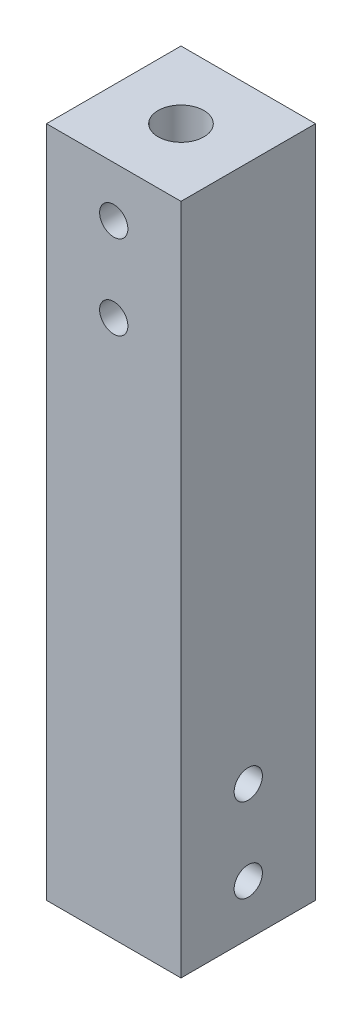
ISO-10303-21;
HEADER;
FILE_DESCRIPTION(('STEP AP214'),'2;1');
FILE_NAME('part.step','',(''),(''),'','','');
FILE_SCHEMA(('AUTOMOTIVE_DESIGN { 1 0 10303 214 1 1 1 1 }'));
ENDSEC;
DATA;
#1=APPLICATION_CONTEXT('core data for automotive mechanical design processes');
#2=APPLICATION_PROTOCOL_DEFINITION('international standard','automotive_design',2000,#1);
#3=PRODUCT_CONTEXT('',#1,'mechanical');
#4=PRODUCT('Part','Part','',(#3));
#5=PRODUCT_RELATED_PRODUCT_CATEGORY('part','',(#4));
#6=PRODUCT_DEFINITION_FORMATION('','',#4);
#7=PRODUCT_DEFINITION_CONTEXT('part definition',#1,'design');
#8=PRODUCT_DEFINITION('design','',#6,#7);
#9=PRODUCT_DEFINITION_SHAPE('','',#8);
#10=(LENGTH_UNIT() NAMED_UNIT(*) SI_UNIT(.MILLI.,.METRE.));
#11=(NAMED_UNIT(*) PLANE_ANGLE_UNIT() SI_UNIT($,.RADIAN.));
#12=(NAMED_UNIT(*) SI_UNIT($,.STERADIAN.) SOLID_ANGLE_UNIT());
#13=UNCERTAINTY_MEASURE_WITH_UNIT(LENGTH_MEASURE(1.E-05),#10,'distance_accuracy_value','');
#14=(GEOMETRIC_REPRESENTATION_CONTEXT(3) GLOBAL_UNCERTAINTY_ASSIGNED_CONTEXT((#13)) GLOBAL_UNIT_ASSIGNED_CONTEXT((#10,
#11,#12)) REPRESENTATION_CONTEXT('',''));
#15=CARTESIAN_POINT('',(0.,0.,0.));
#16=DIRECTION('',(0.,0.,1.));
#17=DIRECTION('',(1.,0.,0.));
#18=AXIS2_PLACEMENT_3D('',#15,#16,#17);
#19=CARTESIAN_POINT('',(0.,100.,0.));
#20=DIRECTION('',(1.,0.,0.));
#21=DIRECTION('',(0.,0.,-1.));
#22=AXIS2_PLACEMENT_3D('',#19,#20,#21);
#23=PLANE('',#22);
#24=DIRECTION('',(0.,0.,1.));
#25=VECTOR('',#24,1.);
#26=CARTESIAN_POINT('',(0.,0.,0.));
#27=LINE('',#26,#25);
#28=CARTESIAN_POINT('',(0.,0.,-20.));
#29=VERTEX_POINT('',#28);
#30=CARTESIAN_POINT('',(0.,0.,0.));
#31=VERTEX_POINT('',#30);
#32=EDGE_CURVE('E171',#29,#31,#27,.T.);
#33=ORIENTED_EDGE('',*,*,#32,.T.);
#34=DIRECTION('',(0.,-1.,0.));
#35=VECTOR('',#34,1.);
#36=CARTESIAN_POINT('',(0.,100.,0.));
#37=LINE('',#36,#35);
#38=CARTESIAN_POINT('',(0.,100.,0.));
#39=VERTEX_POINT('',#38);
#40=EDGE_CURVE('E11',#39,#31,#37,.T.);
#41=ORIENTED_EDGE('',*,*,#40,.F.);
#42=DIRECTION('',(0.,0.,1.));
#43=VECTOR('',#42,1.);
#44=CARTESIAN_POINT('',(0.,100.,0.));
#45=LINE('',#44,#43);
#46=CARTESIAN_POINT('',(0.,100.,-20.));
#47=VERTEX_POINT('',#46);
#48=EDGE_CURVE('E172',#47,#39,#45,.T.);
#49=ORIENTED_EDGE('',*,*,#48,.F.);
#50=DIRECTION('',(0.,-1.,0.));
#51=VECTOR('',#50,1.);
#52=CARTESIAN_POINT('',(0.,100.,-20.));
#53=LINE('',#52,#51);
#54=EDGE_CURVE('E182',#47,#29,#53,.T.);
#55=ORIENTED_EDGE('',*,*,#54,.T.);
#56=EDGE_LOOP('',(#33,#41,#49,#55));
#57=FACE_BOUND('',#56,.T.);
#58=ADVANCED_FACE('F45',(#57),#23,.F.);
#59=CARTESIAN_POINT('',(0.,100.,0.));
#60=DIRECTION('',(0.,0.,-1.));
#61=DIRECTION('',(-1.,0.,0.));
#62=AXIS2_PLACEMENT_3D('',#59,#60,#61);
#63=PLANE('',#62);
#64=CARTESIAN_POINT('',(10.,80.,0.));
#65=DIRECTION('',(0.,0.,1.));
#66=DIRECTION('',(1.,0.,0.));
#67=AXIS2_PLACEMENT_3D('',#64,#65,#66);
#68=CIRCLE('',#67,2.1);
#69=CARTESIAN_POINT('',(12.1,80.,0.));
#70=VERTEX_POINT('',#69);
#71=EDGE_CURVE('E141',#70,#70,#68,.T.);
#72=ORIENTED_EDGE('',*,*,#71,.F.);
#73=EDGE_LOOP('',(#72));
#74=FACE_BOUND('',#73,.T.);
#75=CARTESIAN_POINT('',(10.,92.5,0.));
#76=DIRECTION('',(0.,0.,1.));
#77=DIRECTION('',(1.,0.,0.));
#78=AXIS2_PLACEMENT_3D('',#75,#76,#77);
#79=CIRCLE('',#78,2.1);
#80=CARTESIAN_POINT('',(12.1,92.5,0.));
#81=VERTEX_POINT('',#80);
#82=EDGE_CURVE('E149',#81,#81,#79,.T.);
#83=ORIENTED_EDGE('',*,*,#82,.F.);
#84=EDGE_LOOP('',(#83));
#85=FACE_BOUND('',#84,.T.);
#86=DIRECTION('',(1.,0.,0.));
#87=VECTOR('',#86,1.);
#88=CARTESIAN_POINT('',(0.,0.,0.));
#89=LINE('',#88,#87);
#90=CARTESIAN_POINT('',(20.,0.,0.));
#91=VERTEX_POINT('',#90);
#92=EDGE_CURVE('E186',#31,#91,#89,.T.);
#93=ORIENTED_EDGE('',*,*,#92,.T.);
#94=DIRECTION('',(0.,-1.,0.));
#95=VECTOR('',#94,1.);
#96=CARTESIAN_POINT('',(20.,100.,0.));
#97=LINE('',#96,#95);
#98=CARTESIAN_POINT('',(20.,100.,0.));
#99=VERTEX_POINT('',#98);
#100=EDGE_CURVE('E60',#99,#91,#97,.T.);
#101=ORIENTED_EDGE('',*,*,#100,.F.);
#102=DIRECTION('',(1.,0.,0.));
#103=VECTOR('',#102,1.);
#104=CARTESIAN_POINT('',(0.,100.,0.));
#105=LINE('',#104,#103);
#106=EDGE_CURVE('E100',#39,#99,#105,.T.);
#107=ORIENTED_EDGE('',*,*,#106,.F.);
#108=ORIENTED_EDGE('',*,*,#40,.T.);
#109=EDGE_LOOP('',(#93,#101,#107,#108));
#110=FACE_BOUND('',#109,.T.);
#111=ADVANCED_FACE('F253',(#74,#85,#110),#63,.F.);
#112=CARTESIAN_POINT('',(20.,100.,0.));
#113=DIRECTION('',(-1.,0.,0.));
#114=DIRECTION('',(0.,0.,1.));
#115=AXIS2_PLACEMENT_3D('',#112,#113,#114);
#116=PLANE('',#115);
#117=CARTESIAN_POINT('',(20.,20.,-10.));
#118=DIRECTION('',(1.,0.,0.));
#119=DIRECTION('',(0.,0.,-1.));
#120=AXIS2_PLACEMENT_3D('',#117,#118,#119);
#121=CIRCLE('',#120,2.09999999999999);
#122=CARTESIAN_POINT('',(20.,20.,-12.1));
#123=VERTEX_POINT('',#122);
#124=EDGE_CURVE('E131',#123,#123,#121,.T.);
#125=ORIENTED_EDGE('',*,*,#124,.F.);
#126=EDGE_LOOP('',(#125));
#127=FACE_BOUND('',#126,.T.);
#128=CARTESIAN_POINT('',(20.,7.5,-10.));
#129=DIRECTION('',(1.,0.,0.));
#130=DIRECTION('',(0.,0.,-1.));
#131=AXIS2_PLACEMENT_3D('',#128,#129,#130);
#132=CIRCLE('',#131,2.09999999999999);
#133=CARTESIAN_POINT('',(20.,7.5,-12.1));
#134=VERTEX_POINT('',#133);
#135=EDGE_CURVE('E130',#134,#134,#132,.T.);
#136=ORIENTED_EDGE('',*,*,#135,.F.);
#137=EDGE_LOOP('',(#136));
#138=FACE_BOUND('',#137,.T.);
#139=DIRECTION('',(0.,0.,-1.));
#140=VECTOR('',#139,1.);
#141=CARTESIAN_POINT('',(20.,0.,0.));
#142=LINE('',#141,#140);
#143=CARTESIAN_POINT('',(20.,0.,-20.));
#144=VERTEX_POINT('',#143);
#145=EDGE_CURVE('E87',#91,#144,#142,.T.);
#146=ORIENTED_EDGE('',*,*,#145,.T.);
#147=DIRECTION('',(0.,-1.,0.));
#148=VECTOR('',#147,1.);
#149=CARTESIAN_POINT('',(20.,100.,-20.));
#150=LINE('',#149,#148);
#151=CARTESIAN_POINT('',(20.,100.,-20.));
#152=VERTEX_POINT('',#151);
#153=EDGE_CURVE('E195',#152,#144,#150,.T.);
#154=ORIENTED_EDGE('',*,*,#153,.F.);
#155=DIRECTION('',(0.,0.,-1.));
#156=VECTOR('',#155,1.);
#157=CARTESIAN_POINT('',(20.,100.,0.));
#158=LINE('',#157,#156);
#159=EDGE_CURVE('E177',#99,#152,#158,.T.);
#160=ORIENTED_EDGE('',*,*,#159,.F.);
#161=ORIENTED_EDGE('',*,*,#100,.T.);
#162=EDGE_LOOP('',(#146,#154,#160,#161));
#163=FACE_BOUND('',#162,.T.);
#164=ADVANCED_FACE('F258',(#127,#138,#163),#116,.F.);
#165=CARTESIAN_POINT('',(0.,100.,-20.));
#166=DIRECTION('',(0.,0.,1.));
#167=DIRECTION('',(1.,0.,0.));
#168=AXIS2_PLACEMENT_3D('',#165,#166,#167);
#169=PLANE('',#168);
#170=DIRECTION('',(-1.,0.,0.));
#171=VECTOR('',#170,1.);
#172=CARTESIAN_POINT('',(0.,0.,-20.));
#173=LINE('',#172,#171);
#174=EDGE_CURVE('E93',#144,#29,#173,.T.);
#175=ORIENTED_EDGE('',*,*,#174,.T.);
#176=ORIENTED_EDGE('',*,*,#54,.F.);
#177=DIRECTION('',(-1.,0.,0.));
#178=VECTOR('',#177,1.);
#179=CARTESIAN_POINT('',(0.,100.,-20.));
#180=LINE('',#179,#178);
#181=EDGE_CURVE('E69',#152,#47,#180,.T.);
#182=ORIENTED_EDGE('',*,*,#181,.F.);
#183=ORIENTED_EDGE('',*,*,#153,.T.);
#184=EDGE_LOOP('',(#175,#176,#182,#183));
#185=FACE_BOUND('',#184,.T.);
#186=ADVANCED_FACE('F268',(#185),#169,.F.);
#187=CARTESIAN_POINT('',(0.,100.,0.));
#188=DIRECTION('',(0.,-1.,0.));
#189=DIRECTION('',(0.,0.,-1.));
#190=AXIS2_PLACEMENT_3D('',#187,#188,#189);
#191=PLANE('',#190);
#192=CARTESIAN_POINT('',(10.,100.,-10.));
#193=DIRECTION('',(0.,1.,0.));
#194=DIRECTION('',(0.,0.,1.));
#195=AXIS2_PLACEMENT_3D('',#192,#193,#194);
#196=CIRCLE('',#195,3.39999999999999);
#197=CARTESIAN_POINT('',(10.,100.,-6.60000000000001));
#198=VERTEX_POINT('',#197);
#199=EDGE_CURVE('E163',#198,#198,#196,.T.);
#200=ORIENTED_EDGE('',*,*,#199,.F.);
#201=EDGE_LOOP('',(#200));
#202=FACE_BOUND('',#201,.T.);
#203=ORIENTED_EDGE('',*,*,#48,.T.);
#204=ORIENTED_EDGE('',*,*,#106,.T.);
#205=ORIENTED_EDGE('',*,*,#159,.T.);
#206=ORIENTED_EDGE('',*,*,#181,.T.);
#207=EDGE_LOOP('',(#203,#204,#205,#206));
#208=FACE_BOUND('',#207,.T.);
#209=ADVANCED_FACE('F266',(#202,#208),#191,.F.);
#210=CARTESIAN_POINT('',(0.,0.,0.));
#211=DIRECTION('',(0.,-1.,0.));
#212=DIRECTION('',(0.,0.,-1.));
#213=AXIS2_PLACEMENT_3D('',#210,#211,#212);
#214=PLANE('',#213);
#215=CARTESIAN_POINT('',(10.,0.,-10.));
#216=DIRECTION('',(0.,-1.,0.));
#217=DIRECTION('',(0.,0.,-1.));
#218=AXIS2_PLACEMENT_3D('',#215,#216,#217);
#219=CIRCLE('',#218,3.39999999999999);
#220=CARTESIAN_POINT('',(10.,0.,-13.4));
#221=VERTEX_POINT('',#220);
#222=EDGE_CURVE('E154',#221,#221,#219,.T.);
#223=ORIENTED_EDGE('',*,*,#222,.F.);
#224=EDGE_LOOP('',(#223));
#225=FACE_BOUND('',#224,.T.);
#226=ORIENTED_EDGE('',*,*,#32,.F.);
#227=ORIENTED_EDGE('',*,*,#174,.F.);
#228=ORIENTED_EDGE('',*,*,#145,.F.);
#229=ORIENTED_EDGE('',*,*,#92,.F.);
#230=EDGE_LOOP('',(#226,#227,#228,#229));
#231=FACE_BOUND('',#230,.T.);
#232=ADVANCED_FACE('F264',(#225,#231),#214,.T.);
#233=CARTESIAN_POINT('',(10.,86.25,-10.));
#234=DIRECTION('',(0.,1.,0.));
#235=DIRECTION('',(0.,0.,1.));
#236=AXIS2_PLACEMENT_3D('',#233,#234,#235);
#237=CONICAL_SURFACE('',#236,3.4,1.02974425867665);
#238=CARTESIAN_POINT('',(10.,84.2070738953063,-10.));
#239=VERTEX_POINT('',#238);
#240=VERTEX_LOOP('',#239);
#241=FACE_BOUND('',#240,.T.);
#242=CARTESIAN_POINT('',(10.,86.25,-10.));
#243=DIRECTION('',(0.,1.,0.));
#244=DIRECTION('',(0.,0.,1.));
#245=AXIS2_PLACEMENT_3D('',#242,#243,#244);
#246=CIRCLE('',#245,3.4);
#247=CARTESIAN_POINT('',(10.,86.25,-6.6));
#248=VERTEX_POINT('',#247);
#249=EDGE_CURVE('E167',#248,#248,#246,.T.);
#250=ORIENTED_EDGE('',*,*,#249,.T.);
#251=EDGE_LOOP('',(#250));
#252=FACE_BOUND('',#251,.T.);
#253=ADVANCED_FACE('F275',(#241,#252),#237,.F.);
#254=CARTESIAN_POINT('',(10.,100.,-10.));
#255=DIRECTION('',(0.,1.,0.));
#256=DIRECTION('',(0.,0.,1.));
#257=AXIS2_PLACEMENT_3D('',#254,#255,#256);
#258=CYLINDRICAL_SURFACE('',#257,3.39999999999999);
#259=CARTESIAN_POINT('',(10.,90.4,-6.6));
#260=CARTESIAN_POINT('',(10.106909584779,90.4000083055229,-6.60000759454753));
#261=CARTESIAN_POINT('',(10.2139637283466,90.4082205945675,-6.6050963994989));
#262=CARTESIAN_POINT('',(10.4248054443166,90.4406381015282,-6.62497197905334));
#263=CARTESIAN_POINT('',(10.5285857672476,90.4648765141404,-6.63977888215416));
#264=CARTESIAN_POINT('',(10.7294054383192,90.5279476239572,-6.67759750452509));
#265=CARTESIAN_POINT('',(10.8264754101919,90.5667080076093,-6.70056854105657));
#266=CARTESIAN_POINT('',(11.0124068170342,90.6572474812058,-6.75279017119617));
#267=CARTESIAN_POINT('',(11.1012694815828,90.7090246167031,-6.78203982198288));
#268=CARTESIAN_POINT('',(11.2761942855193,90.8286450562407,-6.84711126815642));
#269=CARTESIAN_POINT('',(11.3614824432051,90.8974335783531,-6.88326950093501));
#270=CARTESIAN_POINT('',(11.5200639802845,91.0469666030035,-6.95745373463822));
#271=CARTESIAN_POINT('',(11.5933411812988,91.1277269570348,-6.99548216652543));
#272=CARTESIAN_POINT('',(11.7356266357533,91.3113783931178,-7.07509364794456));
#273=CARTESIAN_POINT('',(11.8028037152635,91.4157832379848,-7.11648579846966));
#274=CARTESIAN_POINT('',(11.9184431569926,91.6368282791004,-7.19208892783604));
#275=CARTESIAN_POINT('',(11.966936812201,91.7534475967868,-7.22631187016598));
#276=CARTESIAN_POINT('',(12.0330489780256,91.9654756049783,-7.27457460141851));
#277=CARTESIAN_POINT('',(12.0553814632939,92.0587461256088,-7.29153312049159));
#278=CARTESIAN_POINT('',(12.0871147107371,92.2486316697551,-7.31590483461944));
#279=CARTESIAN_POINT('',(12.0965330713176,92.3452419575364,-7.32333101874547));
#280=CARTESIAN_POINT('',(12.1018799243419,92.5393094913836,-7.32752621478394));
#281=CARTESIAN_POINT('',(12.0977758626191,92.6367682171836,-7.32426950856293));
#282=CARTESIAN_POINT('',(12.0762800260879,92.829340632346,-7.30755972114127));
#283=CARTESIAN_POINT('',(12.0588777796012,92.9244524126432,-7.29409860452696));
#284=CARTESIAN_POINT('',(12.0122310678369,93.1080570413213,-7.25924428337621));
#285=CARTESIAN_POINT('',(11.9832268862627,93.1966434253279,-7.23801272610408));
#286=CARTESIAN_POINT('',(11.9144943411793,93.367891406903,-7.18993475740746));
#287=CARTESIAN_POINT('',(11.874762148418,93.4505508755624,-7.16308634187592));
#288=CARTESIAN_POINT('',(11.7773200977145,93.6237139063362,-7.10085345842752));
#289=CARTESIAN_POINT('',(11.7176495762249,93.7128759473009,-7.06480653009435));
#290=CARTESIAN_POINT('',(11.5857435319882,93.8808846428696,-6.99149142415717));
#291=CARTESIAN_POINT('',(11.5134953298841,93.9597207461657,-6.95422204528828));
#292=CARTESIAN_POINT('',(11.3450518867951,94.1174512772022,-6.87577897707396));
#293=CARTESIAN_POINT('',(11.2468776589489,94.194408717777,-6.83491188390569));
#294=CARTESIAN_POINT('',(11.0365789119405,94.330619808723,-6.7599475152374));
#295=CARTESIAN_POINT('',(10.9244605763262,94.3898812670486,-6.72584725625851));
#296=CARTESIAN_POINT('',(10.6956810599504,94.4850633276262,-6.66997298784579));
#297=CARTESIAN_POINT('',(10.5796453934955,94.5221240167928,-6.64760605530692));
#298=CARTESIAN_POINT('',(10.3413214514468,94.5756583354393,-6.61504875173137));
#299=CARTESIAN_POINT('',(10.2190418461389,94.5921597454076,-6.60484195027673));
#300=CARTESIAN_POINT('',(9.99098055767571,94.6026225885336,-6.59837982713387));
#301=CARTESIAN_POINT('',(9.88537226897439,94.5995003702956,-6.60031923792768));
#302=CARTESIAN_POINT('',(9.67643465040614,94.5775783726873,-6.61381406535331));
#303=CARTESIAN_POINT('',(9.57310520186386,94.5587794117044,-6.62536898001818));
#304=CARTESIAN_POINT('',(9.37514682429585,94.5074028314068,-6.65645886027858));
#305=CARTESIAN_POINT('',(9.28034069999321,94.4753230975318,-6.67570467572282));
#306=CARTESIAN_POINT('',(9.09753119340591,94.398783303796,-6.72060692992849));
#307=CARTESIAN_POINT('',(9.00952900698899,94.3543210738652,-6.74626449228702));
#308=CARTESIAN_POINT('',(8.83308855573481,94.2492606487338,-6.80503157314829));
#309=CARTESIAN_POINT('',(8.7455219793061,94.1874789307399,-6.83863432502225));
#310=CARTESIAN_POINT('',(8.58136732717812,94.0520394372682,-6.90880785768252));
#311=CARTESIAN_POINT('',(8.50479187869471,93.9783682055564,-6.94538197781452));
#312=CARTESIAN_POINT('',(8.35361947386747,93.8092196505114,-7.02381844852093));
#313=CARTESIAN_POINT('',(8.28082405252452,93.7121323185385,-7.06569927302227));
#314=CARTESIAN_POINT('',(8.15237135431424,93.5055026910924,-7.14483572716953));
#315=CARTESIAN_POINT('',(8.09670021678827,93.3959705674928,-7.18209508284696));
#316=CARTESIAN_POINT('',(8.01444407675158,93.1906911770339,-7.23964919733963));
#317=CARTESIAN_POINT('',(7.9841923414248,93.0969596554427,-7.26186640457536));
#318=CARTESIAN_POINT('',(7.93697790125541,92.9046130547823,-7.29725611424552));
#319=CARTESIAN_POINT('',(7.91999502577463,92.8060056314165,-7.31044234133015));
#320=CARTESIAN_POINT('',(7.90025925943216,92.6059724164973,-7.3258158759708));
#321=CARTESIAN_POINT('',(7.89757893623707,92.5045348723925,-7.32794709157043));
#322=CARTESIAN_POINT('',(7.90684573577771,92.3027278137854,-7.32068414315933));
#323=CARTESIAN_POINT('',(7.91879888170083,92.2023587562326,-7.31128523330511));
#324=CARTESIAN_POINT('',(7.95518276990627,92.0127722733961,-7.28353404884088));
#325=CARTESIAN_POINT('',(7.97867463354935,91.9232674745665,-7.26585955475902));
#326=CARTESIAN_POINT('',(8.03655154179376,91.7494881718993,-7.22400636533244));
#327=CARTESIAN_POINT('',(8.07094092886698,91.665215769117,-7.19982507772511));
#328=CARTESIAN_POINT('',(8.15546079444471,91.4908385119908,-7.14332043608681));
#329=CARTESIAN_POINT('',(8.207168962054,91.4017207415736,-7.11032149883882));
#330=CARTESIAN_POINT('',(8.32248061149125,91.2325514757411,-7.04188678679635));
#331=CARTESIAN_POINT('',(8.3860938746898,91.1525075229444,-7.0064490234797));
#332=CARTESIAN_POINT('',(8.53738396569212,90.9882311087828,-6.92929353068203));
#333=CARTESIAN_POINT('',(8.62733638960317,90.9060390792976,-6.88764735306934));
#334=CARTESIAN_POINT('',(8.82147085875531,90.7575833108155,-6.80906655444783));
#335=CARTESIAN_POINT('',(8.92566047221144,90.691328095578,-6.77213445968674));
#336=CARTESIAN_POINT('',(9.14545906166423,90.5777976841855,-6.70717367338645));
#337=CARTESIAN_POINT('',(9.26096135551529,90.530363121331,-6.67907066267852));
#338=CARTESIAN_POINT('',(9.4403821716705,90.4749672626327,-6.64581572086231));
#339=CARTESIAN_POINT('',(9.50115474403114,90.4591357602464,-6.63621903883405));
#340=CARTESIAN_POINT('',(9.62426510173862,90.4329317219189,-6.62025743287795));
#341=CARTESIAN_POINT('',(9.6866016490095,90.4225550023467,-6.61389003233458));
#342=CARTESIAN_POINT('',(9.79088936651449,90.4100186901288,-6.60618099421612));
#343=CARTESIAN_POINT('',(9.83258597172236,90.4062659172943,-6.60386732476643));
#344=CARTESIAN_POINT('',(9.91618096797895,90.4012548698967,-6.60077529316417));
#345=CARTESIAN_POINT('',(9.95807937084903,90.3999967432972,-6.59999702207982));
#346=CARTESIAN_POINT('',(10.,90.4,-6.6));
#347=B_SPLINE_CURVE_WITH_KNOTS('',3,(#259,#260,#261,#262,#263,#264,#265,#266,#267,#268,#269,
#270,#271,#272,#273,#274,#275,#276,#277,#278,#279,#280,#281,#282,#283,#284,#285,#286,#287,#288,
#289,#290,#291,#292,#293,#294,#295,#296,#297,#298,#299,#300,#301,#302,#303,#304,#305,#306,#307,
#308,#309,#310,#311,#312,#313,#314,#315,#316,#317,#318,#319,#320,#321,#322,#323,#324,#325,#326,
#327,#328,#329,#330,#331,#332,#333,#334,#335,#336,#337,#338,#339,#340,#341,#342,#343,#344,#345,
#346),.UNSPECIFIED.,.T.,.F.,(4,2,2,2,2,2,2,2,2,2,2,2,2,2,2,2,2,2,2,2,2,2,2,2,2,2,2,2,2,2,2,2,2,
2,2,2,2,2,2,2,2,2,2,4),(0.,0.32055939799291,0.641784855166923,0.961431551788741,
1.28103028254197,1.62584215223706,1.97111472233273,2.36182992370451,2.75188783882831,
3.04285199801862,3.33341925757458,3.62468654554332,3.91618342908424,4.20193227813956,
4.4877832574151,4.82605714883402,5.16467404450676,5.55649371866588,5.94814025488057,
6.31741099530852,6.68618221984855,7.00158556440314,7.31697244470072,7.62147541781026,
7.92603178960799,8.26166323151338,8.59767723091419,8.98107164334386,9.36415490884996,
9.66584505458902,9.96707568932728,10.2698332517716,10.5727154722024,10.8542488166005,
11.1358944884696,11.4592882598545,11.7829489113393,12.1674427472298,12.5521417735468,
12.9335099840297,13.1238232547395,13.3139903479583,13.4396783739624,13.5653738546052),.UNSPECIFIED.);
#348=CARTESIAN_POINT('',(10.,90.4,-6.6));
#349=VERTEX_POINT('',#348);
#350=EDGE_CURVE('E159',#349,#349,#347,.T.);
#351=ORIENTED_EDGE('',*,*,#350,.T.);
#352=EDGE_LOOP('',(#351));
#353=FACE_BOUND('',#352,.T.);
#354=CARTESIAN_POINT('',(9.63129406855639,92.7900036700708,-13.3799491025929));
#355=CARTESIAN_POINT('',(9.65111356220242,92.8093804211386,-13.3821108680189));
#356=CARTESIAN_POINT('',(9.67267078952993,92.8270190827772,-13.3842845231953));
#357=CARTESIAN_POINT('',(9.71844397164157,92.8585220608813,-13.3884002305228));
#358=CARTESIAN_POINT('',(9.74266620773809,92.8723771802601,-13.3903417119818));
#359=CARTESIAN_POINT('',(9.7932193591738,92.8961922123673,-13.3938014041982));
#360=CARTESIAN_POINT('',(9.81956554728729,92.9061201877377,-13.3953161167871));
#361=CARTESIAN_POINT('',(9.87348132810256,92.9217856719524,-13.3977523930356));
#362=CARTESIAN_POINT('',(9.90105036784806,92.9275250547356,-13.398674221924));
#363=CARTESIAN_POINT('',(9.95882739123461,92.9350133282234,-13.3998822311503));
#364=CARTESIAN_POINT('',(9.98907940766686,92.936434553324,-13.4001161755556));
#365=CARTESIAN_POINT('',(10.0494157466226,92.9343373429141,-13.3997748620723));
#366=CARTESIAN_POINT('',(10.0795000052387,92.9308171389356,-13.3991993144775));
#367=CARTESIAN_POINT('',(10.1391661153035,92.918788524235,-13.3972839947183));
#368=CARTESIAN_POINT('',(10.1687308300249,92.9101966463008,-13.3959314452442));
#369=CARTESIAN_POINT('',(10.2259359207021,92.888089569949,-13.392605816638));
#370=CARTESIAN_POINT('',(10.2535760386857,92.8745737130306,-13.3906326545139));
#371=CARTESIAN_POINT('',(10.3053247732215,92.8432298845371,-13.3863600622848));
#372=CARTESIAN_POINT('',(10.3295047610521,92.8255189980462,-13.3840700932468));
#373=CARTESIAN_POINT('',(10.3741640983998,92.7859072170798,-13.3794238363886));
#374=CARTESIAN_POINT('',(10.3946452446296,92.7640083676092,-13.3770675814132));
#375=CARTESIAN_POINT('',(10.4291532775219,92.7186904760515,-13.3728478623278));
#376=CARTESIAN_POINT('',(10.4435998158712,92.6955950212572,-13.3709590223395));
#377=CARTESIAN_POINT('',(10.4676525391931,92.6469782307085,-13.3677069544126));
#378=CARTESIAN_POINT('',(10.4772662625308,92.6214607472917,-13.3663429086696));
#379=CARTESIAN_POINT('',(10.489931543553,92.5727849583848,-13.3645210350162));
#380=CARTESIAN_POINT('',(10.493735691305,92.5498253850721,-13.3639600510503));
#381=CARTESIAN_POINT('',(10.4970358771788,92.5035955016247,-13.3634742080895));
#382=CARTESIAN_POINT('',(10.4965345008075,92.4803253863556,-13.3635489673246));
#383=CARTESIAN_POINT('',(10.4915139462796,92.436459984065,-13.3642857906915));
#384=CARTESIAN_POINT('',(10.4873761439805,92.4158185778245,-13.3648920940071));
#385=CARTESIAN_POINT('',(10.4758258715522,92.3754967211641,-13.3665447420789));
#386=CARTESIAN_POINT('',(10.4684130976294,92.3558163600811,-13.3675911276576));
#387=CARTESIAN_POINT('',(10.4503803211682,92.3172622033427,-13.3700507964373));
#388=CARTESIAN_POINT('',(10.4396672215642,92.2984329137987,-13.3714745354372));
#389=CARTESIAN_POINT('',(10.4155600589433,92.2626016739677,-13.374530674952));
#390=CARTESIAN_POINT('',(10.4021649730154,92.2456004247104,-13.3761631549947));
#391=CARTESIAN_POINT('',(10.3714066654575,92.2117704436714,-13.3796928044248));
#392=CARTESIAN_POINT('',(10.3537616589982,92.1951990955635,-13.3815984678181));
#393=CARTESIAN_POINT('',(10.3162120820769,92.1648437844021,-13.3853162786986));
#394=CARTESIAN_POINT('',(10.2963063651395,92.1510612455828,-13.387128378053));
#395=CARTESIAN_POINT('',(10.252021017678,92.1248230755495,-13.3907285236147));
#396=CARTESIAN_POINT('',(10.2273965187768,92.1127751756633,-13.3924825855408));
#397=CARTESIAN_POINT('',(10.1765686976831,92.0925821507525,-13.3955076991084));
#398=CARTESIAN_POINT('',(10.1503647527381,92.0844385766286,-13.3967785587677));
#399=CARTESIAN_POINT('',(10.0947143069554,92.0716308516652,-13.3988039234041));
#400=CARTESIAN_POINT('',(10.0651826524986,92.067325781603,-13.3995046797525));
#401=CARTESIAN_POINT('',(10.0058013177314,92.0635103468532,-13.4001248157618));
#402=CARTESIAN_POINT('',(9.97595157087841,92.0640010058775,-13.4000440285921));
#403=CARTESIAN_POINT('',(9.91581557307605,92.0698601739,-13.3990946258146));
#404=CARTESIAN_POINT('',(9.88554408424369,92.0753780735368,-13.3982018833675));
#405=CARTESIAN_POINT('',(9.82637765367679,92.0914162514136,-13.3956932376286));
#406=CARTESIAN_POINT('',(9.79748293623198,92.1019373416784,-13.3940772169503));
#407=CARTESIAN_POINT('',(9.74228131016279,92.1276765448892,-13.3903301362397));
#408=CARTESIAN_POINT('',(9.71594946454903,92.1428417999331,-13.3882049279737));
#409=CARTESIAN_POINT('',(9.66645637889417,92.1776776250621,-13.3836912214036));
#410=CARTESIAN_POINT('',(9.64329472456051,92.1973476055528,-13.3813027575766));
#411=CARTESIAN_POINT('',(9.60264962830954,92.2393297200457,-13.3767592426042));
#412=CARTESIAN_POINT('',(9.58488586411018,92.2613684741649,-13.3745994116458));
#413=CARTESIAN_POINT('',(9.55400641440723,92.3085232619652,-13.3706576990103));
#414=CARTESIAN_POINT('',(9.54088417535033,92.3336348889139,-13.3688752858818));
#415=CARTESIAN_POINT('',(9.52163715418822,92.3824958718309,-13.3661923137658));
#416=CARTESIAN_POINT('',(9.51479922166176,92.4059592546325,-13.3652043035011));
#417=CARTESIAN_POINT('',(9.50573879167162,92.453772748394,-13.3638858454626));
#418=CARTESIAN_POINT('',(9.50351147568835,92.4781219065192,-13.3635547112079));
#419=CARTESIAN_POINT('',(9.50380665078235,92.5237897235333,-13.3635979534837));
#420=CARTESIAN_POINT('',(9.50578044876456,92.5451140436425,-13.3638908346114));
#421=CARTESIAN_POINT('',(9.5132785396697,92.5871180350326,-13.3649838657497));
#422=CARTESIAN_POINT('',(9.51880365416721,92.6077975559822,-13.3657841331403));
#423=CARTESIAN_POINT('',(9.5330613623988,92.6478273822137,-13.3677914447594));
#424=CARTESIAN_POINT('',(9.54177215783468,92.6671856842192,-13.3689957200044));
#425=CARTESIAN_POINT('',(9.56201521914871,92.7043200954561,-13.3716869558394));
#426=CARTESIAN_POINT('',(9.57354520103201,92.722097469673,-13.3731736873781));
#427=CARTESIAN_POINT('',(9.59312155409625,92.7480087782947,-13.3755736614268));
#428=CARTESIAN_POINT('',(9.60031796746938,92.7568050397153,-13.3764347026831));
#429=CARTESIAN_POINT('',(9.615343769854,92.773832626371,-13.3781795342506));
#430=CARTESIAN_POINT('',(9.6231730411148,92.7820640561754,-13.379063320309));
#431=CARTESIAN_POINT('',(9.63129406855639,92.7900036700708,-13.3799491025929));
#432=B_SPLINE_CURVE_WITH_KNOTS('',3,(#354,#355,#356,#357,#358,#359,#360,#361,#362,#363,#364,
#365,#366,#367,#368,#369,#370,#371,#372,#373,#374,#375,#376,#377,#378,#379,#380,#381,#382,#383,
#384,#385,#386,#387,#388,#389,#390,#391,#392,#393,#394,#395,#396,#397,#398,#399,#400,#401,#402,
#403,#404,#405,#406,#407,#408,#409,#410,#411,#412,#413,#414,#415,#416,#417,#418,#419,#420,#421,
#422,#423,#424,#425,#426,#427,#428,#429,#430,#431),.UNSPECIFIED.,.T.,.F.,(4,2,2,2,2,2,2,2,2,2,2,
2,2,2,2,2,2,2,2,2,2,2,2,2,2,2,2,2,2,2,2,2,2,2,2,2,2,2,4),(0.,0.0833631966671376,
0.166927265543384,0.251157593237053,0.335350213894598,0.425789442183172,0.516261045655664,
0.608264813697467,0.700280890240562,0.789981171464563,0.879637762883259,0.961072187196749,
1.04237919049893,1.11182749231661,1.18123409270765,1.24412875514772,1.30702925306257,
1.37189791817481,1.43679137151757,1.50934692193135,1.58193943318535,1.66400305275109,
1.74609924318743,1.83524932101313,1.92441842951644,2.01632692581216,2.10825034407703,
2.19916414166343,2.29006604692457,2.37473953833018,2.45929299411095,2.53224297084463,
2.60511666955317,2.66905873976168,2.7330156078899,2.79654279242129,2.86001867925423,
2.8941830488092,2.92834107624642),.UNSPECIFIED.);
#433=CARTESIAN_POINT('',(9.63129406855639,92.7900036700708,-13.3799491025929));
#434=VERTEX_POINT('',#433);
#435=EDGE_CURVE('E153',#434,#434,#432,.T.);
#436=ORIENTED_EDGE('',*,*,#435,.T.);
#437=EDGE_LOOP('',(#436));
#438=FACE_BOUND('',#437,.T.);
#439=ORIENTED_EDGE('',*,*,#249,.F.);
#440=EDGE_LOOP('',(#439));
#441=FACE_BOUND('',#440,.T.);
#442=ORIENTED_EDGE('',*,*,#199,.T.);
#443=EDGE_LOOP('',(#442));
#444=FACE_BOUND('',#443,.T.);
#445=ADVANCED_FACE('F212',(#353,#438,#441,#444),#258,.F.);
#446=CARTESIAN_POINT('',(10.,13.75,-10.));
#447=DIRECTION('',(0.,-1.,0.));
#448=DIRECTION('',(0.,0.,-1.));
#449=AXIS2_PLACEMENT_3D('',#446,#447,#448);
#450=CONICAL_SURFACE('',#449,3.4,1.02974425867665);
#451=CARTESIAN_POINT('',(10.,15.7929261046937,-10.));
#452=VERTEX_POINT('',#451);
#453=VERTEX_LOOP('',#452);
#454=FACE_BOUND('',#453,.T.);
#455=CARTESIAN_POINT('',(10.,13.75,-10.));
#456=DIRECTION('',(0.,-1.,0.));
#457=DIRECTION('',(0.,0.,-1.));
#458=AXIS2_PLACEMENT_3D('',#455,#456,#457);
#459=CIRCLE('',#458,3.4);
#460=CARTESIAN_POINT('',(10.,13.75,-13.4));
#461=VERTEX_POINT('',#460);
#462=EDGE_CURVE('E158',#461,#461,#459,.T.);
#463=ORIENTED_EDGE('',*,*,#462,.T.);
#464=EDGE_LOOP('',(#463));
#465=FACE_BOUND('',#464,.T.);
#466=ADVANCED_FACE('F226',(#454,#465),#450,.F.);
#467=CARTESIAN_POINT('',(10.,0.,-10.));
#468=DIRECTION('',(0.,-1.,0.));
#469=DIRECTION('',(0.,0.,-1.));
#470=AXIS2_PLACEMENT_3D('',#467,#468,#469);
#471=CYLINDRICAL_SURFACE('',#470,3.39999999999999);
#472=CARTESIAN_POINT('',(12.6739483914242,7.5,-12.1));
#473=CARTESIAN_POINT('',(12.6739610113809,7.60467904226486,-12.0999918862109));
#474=CARTESIAN_POINT('',(12.6802093934933,7.70953493385813,-12.0921018484001));
#475=CARTESIAN_POINT('',(12.7041179400223,7.9157500842561,-12.0610919822798));
#476=CARTESIAN_POINT('',(12.7218106974976,8.01709848268177,-12.03792865267));
#477=CARTESIAN_POINT('',(12.7656635883293,8.212687802904,-11.9779929515485));
#478=CARTESIAN_POINT('',(12.7917515972957,8.3069811221234,-11.9413361311584));
#479=CARTESIAN_POINT('',(12.8493313139399,8.48796077410852,-11.8557922033485));
#480=CARTESIAN_POINT('',(12.8808229339303,8.57464723028045,-11.8069052943872));
#481=CARTESIAN_POINT('',(12.9506272563945,8.75041422270417,-11.6908448141345));
#482=CARTESIAN_POINT('',(12.9892936162628,8.83832824263121,-11.6221166664703));
#483=CARTESIAN_POINT('',(13.066244140119,9.00236489512897,-11.4714997465579));
#484=CARTESIAN_POINT('',(13.1045279499978,9.07847740669455,-11.3895997994133));
#485=CARTESIAN_POINT('',(13.1816928729535,9.22555351360142,-11.2033807878212));
#486=CARTESIAN_POINT('',(13.2201215347832,9.29487753703828,-11.0975604931066));
#487=CARTESIAN_POINT('',(13.2881161066096,9.41418665710414,-10.8729325645918));
#488=CARTESIAN_POINT('',(13.3176906093381,9.4641905172374,-10.7541376761469));
#489=CARTESIAN_POINT('',(13.3619898388173,9.53807653177527,-10.5194501278611));
#490=CARTESIAN_POINT('',(13.3779023013162,9.56406811757307,-10.4044517052661));
#491=CARTESIAN_POINT('',(13.3977266634575,9.59635828422775,-10.1707458527));
#492=CARTESIAN_POINT('',(13.4016507757289,9.60267690621713,-10.0520423218078));
#493=CARTESIAN_POINT('',(13.3973621468313,9.59572522276318,-9.83111484709011));
#494=CARTESIAN_POINT('',(13.3906738354962,9.58491560936775,-9.72877157867804));
#495=CARTESIAN_POINT('',(13.3685524008778,9.5487437034368,-9.52768240010947));
#496=CARTESIAN_POINT('',(13.3531186165895,9.52338031088789,-9.42893676247153));
#497=CARTESIAN_POINT('',(13.3147611731353,9.45915919056251,-9.2371294578897));
#498=CARTESIAN_POINT('',(13.2918109413459,9.42025355628968,-9.1440893676081));
#499=CARTESIAN_POINT('',(13.240216227837,9.33039691227402,-8.9657727888472));
#500=CARTESIAN_POINT('',(13.2115703972853,9.27944304872646,-8.88049814636993));
#501=CARTESIAN_POINT('',(13.1468103551656,9.15989431307987,-8.70887822165667));
#502=CARTESIAN_POINT('',(13.110210899813,9.08990028744217,-8.62369211380303));
#503=CARTESIAN_POINT('',(13.0353070639468,8.93786968795666,-8.46553324266295));
#504=CARTESIAN_POINT('',(12.9970003058399,8.85581592987073,-8.39257823072271));
#505=CARTESIAN_POINT('',(12.9172699365886,8.66979245216766,-8.25160644067956));
#506=CARTESIAN_POINT('',(12.8760633094271,8.56436371831633,-8.18537563860498));
#507=CARTESIAN_POINT('',(12.8012350353127,8.34134266285322,-8.07186022026546));
#508=CARTESIAN_POINT('',(12.7675994144318,8.22377334448697,-8.02454057203247));
#509=CARTESIAN_POINT('',(12.7208691431286,8.01082909621246,-7.96088034392542));
#510=CARTESIAN_POINT('',(12.7047118444924,7.91757825691153,-7.93969282147629));
#511=CARTESIAN_POINT('',(12.6820051729033,7.72796053325378,-7.91021323543647));
#512=CARTESIAN_POINT('',(12.6754432686795,7.63159788132457,-7.90190435191258));
#513=CARTESIAN_POINT('',(12.6729104384627,7.43831211143207,-7.89867751792015));
#514=CARTESIAN_POINT('',(12.6769607180975,7.3413882580298,-7.90378637929588));
#515=CARTESIAN_POINT('',(12.6950614050933,7.15006308565705,-7.92711560222272));
#516=CARTESIAN_POINT('',(12.7091200074543,7.05566389969744,-7.94534670864642));
#517=CARTESIAN_POINT('',(12.7450682555591,6.8728091144794,-7.99363976553353));
#518=CARTESIAN_POINT('',(12.7668645006656,6.78429696489623,-8.02356102035896));
#519=CARTESIAN_POINT('',(12.8159349110133,6.61331442243361,-8.09412642881083));
#520=CARTESIAN_POINT('',(12.8432110496868,6.5308462207589,-8.13477444704282));
#521=CARTESIAN_POINT('',(12.9063404658083,6.35786577037682,-8.23441892944317));
#522=CARTESIAN_POINT('',(12.9428427274776,6.26874871774138,-8.29542726120126));
#523=CARTESIAN_POINT('',(13.0168519494702,6.10104964929531,-8.43012020496834));
#524=CARTESIAN_POINT('',(13.054359899438,6.02247850453501,-8.50381772148511));
#525=CARTESIAN_POINT('',(13.1328154767844,5.86605396239239,-8.6750066152542));
#526=CARTESIAN_POINT('',(13.1734271197786,5.79010093181667,-8.77441051895032));
#527=CARTESIAN_POINT('',(13.2475568998873,5.65616359980026,-8.98707116473593));
#528=CARTESIAN_POINT('',(13.2810788277191,5.5981696882674,-9.10032045261942));
#529=CARTESIAN_POINT('',(13.3353363755056,5.50606895877249,-9.33024899176577));
#530=CARTESIAN_POINT('',(13.3567541488414,5.47066870922706,-9.44624245705891));
#531=CARTESIAN_POINT('',(13.3874057558049,5.42035419430516,-9.68409821455823));
#532=CARTESIAN_POINT('',(13.3966555087029,5.40541316133939,-9.80595262205691));
#533=CARTESIAN_POINT('',(13.4014597623096,5.39763846708945,-10.0330383947485));
#534=CARTESIAN_POINT('',(13.3987889817109,5.4019401913647,-10.1381460376771));
#535=CARTESIAN_POINT('',(13.3839630939261,5.42604282412023,-10.3458728477989));
#536=CARTESIAN_POINT('',(13.3718082345418,5.44584332764575,-10.4484920799375));
#537=CARTESIAN_POINT('',(13.3396154688397,5.49913401108174,-10.6454911504911));
#538=CARTESIAN_POINT('',(13.3198153371844,5.53221236258099,-10.7400233456937));
#539=CARTESIAN_POINT('',(13.2739090433057,5.61069012695372,-10.922143552682));
#540=CARTESIAN_POINT('',(13.2478017369723,5.65609177543556,-11.0097303007431));
#541=CARTESIAN_POINT('',(13.1881238288334,5.76324364103022,-11.1854800532095));
#542=CARTESIAN_POINT('',(13.1540563289321,5.8262136512459,-11.2727280617522));
#543=CARTESIAN_POINT('',(13.0831244438956,5.96404741976281,-11.4360679887891));
#544=CARTESIAN_POINT('',(13.0462568771564,6.0389248168529,-11.5121469196131));
#545=CARTESIAN_POINT('',(12.9674989061893,6.21055465711689,-11.6619450439946));
#546=CARTESIAN_POINT('',(12.9256248935749,6.30890146588149,-11.7338562184168));
#547=CARTESIAN_POINT('',(12.8469003300844,6.51807126466799,-11.8602991106615));
#548=CARTESIAN_POINT('',(12.8100465287888,6.62888609636341,-11.9148421047012));
#549=CARTESIAN_POINT('',(12.7539696421629,6.83524550071453,-11.9943606043632));
#550=CARTESIAN_POINT('',(12.7326491293437,6.92872634470604,-12.0232107820716));
#551=CARTESIAN_POINT('',(12.6991564682664,7.12021499234771,-12.0676922720582));
#552=CARTESIAN_POINT('',(12.6869547102251,7.21820703739123,-12.0833663895992));
#553=CARTESIAN_POINT('',(12.678123788191,7.34742683835363,-12.0946737200208));
#554=CARTESIAN_POINT('',(12.6765623606121,7.37787912963853,-12.0966682254729));
#555=CARTESIAN_POINT('',(12.6744727064262,7.43888257419132,-12.0993326953104));
#556=CARTESIAN_POINT('',(12.6739447064002,7.46943374766891,-12.1000023692242));
#557=CARTESIAN_POINT('',(12.6739483914242,7.5,-12.1));
#558=B_SPLINE_CURVE_WITH_KNOTS('',3,(#472,#473,#474,#475,#476,#477,#478,#479,#480,#481,#482,
#483,#484,#485,#486,#487,#488,#489,#490,#491,#492,#493,#494,#495,#496,#497,#498,#499,#500,#501,
#502,#503,#504,#505,#506,#507,#508,#509,#510,#511,#512,#513,#514,#515,#516,#517,#518,#519,#520,
#521,#522,#523,#524,#525,#526,#527,#528,#529,#530,#531,#532,#533,#534,#535,#536,#537,#538,#539,
#540,#541,#542,#543,#544,#545,#546,#547,#548,#549,#550,#551,#552,#553,#554,#555,#556,#557),
.UNSPECIFIED.,.T.,.F.,(4,2,2,2,2,2,2,2,2,2,2,2,2,2,2,2,2,2,2,2,2,2,2,2,2,2,2,2,2,2,2,2,2,2,2,2,
2,2,2,2,2,2,4),(0.,0.313896674080756,0.628691271189521,0.940850572197424,1.25300480810622,
1.60593606393233,1.9591683401123,2.35365557858265,2.74775872708062,3.10251754660727,
3.45691484975306,3.76482728319473,4.07276299254452,4.38179930392575,4.69090888867311,
5.03805048771669,5.38569162203661,5.77721782858877,6.16801535263559,6.45774015320213,
6.74708624369569,7.03701095616055,7.32717333780364,7.61394604878348,7.9008222187478,
8.24154006992771,8.58260648958722,8.97518072262446,9.36754452107267,9.73474456608874,
10.1014637284882,10.4155612411155,10.7296505472233,11.0346698888152,11.3397446019588,
11.6770205140648,12.0146855639624,12.3994308421803,12.7839258144403,13.0831499023243,
13.3813980978601,13.4730357532148,13.5646934980532),.UNSPECIFIED.);
#559=CARTESIAN_POINT('',(12.6739483914242,7.5,-12.1));
#560=VERTEX_POINT('',#559);
#561=EDGE_CURVE('E48',#560,#560,#558,.T.);
#562=ORIENTED_EDGE('',*,*,#561,.T.);
#563=EDGE_LOOP('',(#562));
#564=FACE_BOUND('',#563,.T.);
#565=CARTESIAN_POINT('',(6.62005089740714,7.79000367007076,-10.3687059314436));
#566=CARTESIAN_POINT('',(6.62170964304523,7.77513539094238,-10.3839134451077));
#567=CARTESIAN_POINT('',(6.62336244655791,7.75923484860098,-10.3981081876877));
#568=CARTESIAN_POINT('',(6.6265267814687,7.72554310264062,-10.4240867813501));
#569=CARTESIAN_POINT('',(6.62803827796807,7.70775143427447,-10.435870037715));
#570=CARTESIAN_POINT('',(6.63102679997296,7.66723266664712,-10.4584454076855));
#571=CARTESIAN_POINT('',(6.63244992119374,7.64419047504965,-10.4686888605378));
#572=CARTESIAN_POINT('',(6.6346996096261,7.59653971476403,-10.4845816014742));
#573=CARTESIAN_POINT('',(6.63552652265178,7.57193206310659,-10.4902335529733));
#574=CARTESIAN_POINT('',(6.63639400164286,7.52509659377068,-10.496147134981));
#575=CARTESIAN_POINT('',(6.63651763906575,7.50294128165653,-10.4969784519946));
#576=CARTESIAN_POINT('',(6.63618533981761,7.45884098925968,-10.4947245253172));
#577=CARTESIAN_POINT('',(6.63572959844315,7.43689594061329,-10.4916406013732));
#578=CARTESIAN_POINT('',(6.63433660918578,7.39501384911938,-10.4820078498511));
#579=CARTESIAN_POINT('',(6.63342568522967,7.37503175722351,-10.4756479174256));
#580=CARTESIAN_POINT('',(6.63123792163406,7.33632739640071,-10.4598966681758));
#581=CARTESIAN_POINT('',(6.62996100410827,7.31760539667951,-10.450504706058));
#582=CARTESIAN_POINT('',(6.62707009118757,7.28055324825704,-10.4283415948702));
#583=CARTESIAN_POINT('',(6.6254390728951,7.26233642512449,-10.4153840114495));
#584=CARTESIAN_POINT('',(6.62205783051496,7.22802869796476,-10.386926358987));
#585=CARTESIAN_POINT('',(6.62030755275867,7.21193876077372,-10.3714251407916));
#586=CARTESIAN_POINT('',(6.61660793948892,7.18013156182559,-10.3361710967576));
#587=CARTESIAN_POINT('',(6.61466239098366,7.16473617567837,-10.3161274610542));
#588=CARTESIAN_POINT('',(6.61098896336498,7.13709694419757,-10.273957641022));
#589=CARTESIAN_POINT('',(6.60926119173361,7.12485465196283,-10.2518304377037));
#590=CARTESIAN_POINT('',(6.60598500623748,7.102382198425,-10.2032773678272));
#591=CARTESIAN_POINT('',(6.60448300900646,7.0925698967616,-10.1766543169089));
#592=CARTESIAN_POINT('',(6.60208651983946,7.07719974760447,-10.1221808117402));
#593=CARTESIAN_POINT('',(6.60119223077498,7.07164332077276,-10.0943299509104));
#594=CARTESIAN_POINT('',(6.60006084846293,7.06463891323512,-10.0362212675451));
#595=CARTESIAN_POINT('',(6.59987127367139,7.06348784274431,-10.0059263126658));
#596=CARTESIAN_POINT('',(6.6003018152372,7.06613427907656,-9.94555586154281));
#597=CARTESIAN_POINT('',(6.60092207203019,7.06993264419782,-9.91548040427247));
#598=CARTESIAN_POINT('',(6.60292184300711,7.08251926098023,-9.85590925758734));
#599=CARTESIAN_POINT('',(6.60431333784355,7.09138632129459,-9.82643052567576));
#600=CARTESIAN_POINT('',(6.60770578227444,7.11403378615031,-9.76944625737992));
#601=CARTESIAN_POINT('',(6.60970682979639,7.12781498023102,-9.74194103892775));
#602=CARTESIAN_POINT('',(6.61401592950853,7.15964524101764,-9.69054931344603));
#603=CARTESIAN_POINT('',(6.61631440178728,7.17757105879471,-9.66658602214046));
#604=CARTESIAN_POINT('',(6.62095922106973,7.21757922190744,-9.6224062789926));
#605=CARTESIAN_POINT('',(6.62330554224034,7.23965937470031,-9.60218786182897));
#606=CARTESIAN_POINT('',(6.62748325603419,7.2852287100982,-9.56826365327078));
#607=CARTESIAN_POINT('',(6.62934230740389,7.30839127529232,-9.55412478019469));
#608=CARTESIAN_POINT('',(6.63252392998668,7.35708030066253,-9.53069578454198));
#609=CARTESIAN_POINT('',(6.63384733656351,7.38260300311808,-9.52139810535289));
#610=CARTESIAN_POINT('',(6.63559024981465,7.43121769226882,-9.50930805043865));
#611=CARTESIAN_POINT('',(6.63611357012118,7.45411999724467,-9.50576369432722));
#612=CARTESIAN_POINT('',(6.63652762683093,7.50018793726457,-9.5029525185789));
#613=CARTESIAN_POINT('',(6.63641872141494,7.52335341578689,-9.50368327692301));
#614=CARTESIAN_POINT('',(6.6356235167927,7.56705422412727,-9.50910619991838));
#615=CARTESIAN_POINT('',(6.63499054260862,7.58763738099757,-9.51343264554542));
#616=CARTESIAN_POINT('',(6.63329067835199,7.62781670753226,-9.52533778729025));
#617=CARTESIAN_POINT('',(6.63222374426418,7.64741277685265,-9.53291681331192));
#618=CARTESIAN_POINT('',(6.62972579519084,7.68583987699853,-9.55129060513775));
#619=CARTESIAN_POINT('',(6.62828346473517,7.70462101028818,-9.5621875210808));
#620=CARTESIAN_POINT('',(6.62519721382342,7.74033178686709,-9.58665030557051));
#621=CARTESIAN_POINT('',(6.62355321526463,7.75726070799273,-9.60021720939632));
#622=CARTESIAN_POINT('',(6.6200049839765,7.79093711064592,-9.63134466678328));
#623=CARTESIAN_POINT('',(6.61809311850692,7.80742152654749,-9.64918865761765));
#624=CARTESIAN_POINT('',(6.6143727920014,7.8375735410926,-9.68712290045773));
#625=CARTESIAN_POINT('',(6.61256438447201,7.85123969152902,-9.70721429918874));
#626=CARTESIAN_POINT('',(6.60898357334373,7.87719221259563,-9.75186513210723));
#627=CARTESIAN_POINT('',(6.60724633352696,7.88906902209212,-9.77666598351375));
#628=CARTESIAN_POINT('',(6.60426573328651,7.90888922875939,-9.82781969115046));
#629=CARTESIAN_POINT('',(6.60302255882524,7.91683114514355,-9.85417312748441));
#630=CARTESIAN_POINT('',(6.60106555685626,7.92917867112579,-9.91005889670103));
#631=CARTESIAN_POINT('',(6.60040517305276,7.93322982889338,-9.93967195553012));
#632=CARTESIAN_POINT('',(6.59986980815682,7.9365216533016,-9.99917520979271));
#633=CARTESIAN_POINT('',(6.59999503940583,7.93576101937751,-10.0290654779723));
#634=CARTESIAN_POINT('',(6.60103340322644,7.92934580216205,-10.0891990802314));
#635=CARTESIAN_POINT('',(6.60196966644156,7.92354753082058,-10.1194268240066));
#636=CARTESIAN_POINT('',(6.604557932001,7.90695171760395,-10.1784535702712));
#637=CARTESIAN_POINT('',(6.606209905273,7.89615437879099,-10.2072526307413));
#638=CARTESIAN_POINT('',(6.60982874840377,7.87116433071008,-10.2595203011192));
#639=CARTESIAN_POINT('',(6.61174237552567,7.85746396563353,-10.283228733373));
#640=CARTESIAN_POINT('',(6.61579107142186,7.82640529603774,-10.3280787100592));
#641=CARTESIAN_POINT('',(6.61792586065505,7.8090515812529,-10.3492234232747));
#642=CARTESIAN_POINT('',(6.62005089740714,7.79000367007076,-10.3687059314436));
#643=B_SPLINE_CURVE_WITH_KNOTS('',3,(#565,#566,#567,#568,#569,#570,#571,#572,#573,#574,#575,
#576,#577,#578,#579,#580,#581,#582,#583,#584,#585,#586,#587,#588,#589,#590,#591,#592,#593,#594,
#595,#596,#597,#598,#599,#600,#601,#602,#603,#604,#605,#606,#607,#608,#609,#610,#611,#612,#613,
#614,#615,#616,#617,#618,#619,#620,#621,#622,#623,#624,#625,#626,#627,#628,#629,#630,#631,#632,
#633,#634,#635,#636,#637,#638,#639,#640,#641,#642),.UNSPECIFIED.,.T.,.F.,(4,2,2,2,2,2,2,2,2,2,2,
2,2,2,2,2,2,2,2,2,2,2,2,2,2,2,2,2,2,2,2,2,2,2,2,2,2,2,4),(0.,0.0639360328067023,
0.127887814481619,0.203209400539944,0.278487263171241,0.344652613750852,0.410795667275866,
0.47349262160475,0.536202928253261,0.603179865410084,0.670187144887192,0.745927521442796,
0.821705133899118,0.906577818910245,0.991478823108221,1.08201044438846,1.17255776714983,
1.26455278414011,1.35656258836235,1.44612543783522,1.53564115044397,1.61675739485318,
1.69774664258055,1.76690300922988,1.83602019989698,1.89886157510873,1.96170932572498,
2.02673064758247,2.09177723109741,2.16459125351984,2.23744259977225,2.31975327143204,
2.40209489492097,2.4913762623664,2.58068176243523,2.6726213785219,2.76455726034753,
2.84656881825213,2.92847795270709),.UNSPECIFIED.);
#644=CARTESIAN_POINT('',(6.62005089740714,7.79000367007076,-10.3687059314436));
#645=VERTEX_POINT('',#644);
#646=EDGE_CURVE('E136',#645,#645,#643,.T.);
#647=ORIENTED_EDGE('',*,*,#646,.T.);
#648=EDGE_LOOP('',(#647));
#649=FACE_BOUND('',#648,.T.);
#650=ORIENTED_EDGE('',*,*,#462,.F.);
#651=EDGE_LOOP('',(#650));
#652=FACE_BOUND('',#651,.T.);
#653=ORIENTED_EDGE('',*,*,#222,.T.);
#654=EDGE_LOOP('',(#653));
#655=FACE_BOUND('',#654,.T.);
#656=ADVANCED_FACE('F220',(#564,#649,#652,#655),#471,.F.);
#657=CARTESIAN_POINT('',(10.,92.5,-12.4));
#658=DIRECTION('',(0.,0.,1.));
#659=DIRECTION('',(1.,0.,0.));
#660=AXIS2_PLACEMENT_3D('',#657,#658,#659);
#661=CONICAL_SURFACE('',#660,2.1,1.02974425867665);
#662=CARTESIAN_POINT('',(10.,92.5,-13.6618072999579));
#663=VERTEX_POINT('',#662);
#664=VERTEX_LOOP('',#663);
#665=FACE_BOUND('',#664,.T.);
#666=ORIENTED_EDGE('',*,*,#435,.F.);
#667=EDGE_LOOP('',(#666));
#668=FACE_BOUND('',#667,.T.);
#669=ADVANCED_FACE('F216',(#665,#668),#661,.F.);
#670=CARTESIAN_POINT('',(10.,92.5,0.));
#671=DIRECTION('',(0.,0.,1.));
#672=DIRECTION('',(1.,0.,0.));
#673=AXIS2_PLACEMENT_3D('',#670,#671,#672);
#674=CYLINDRICAL_SURFACE('',#673,2.1);
#675=ORIENTED_EDGE('',*,*,#82,.T.);
#676=EDGE_LOOP('',(#675));
#677=FACE_BOUND('',#676,.T.);
#678=ORIENTED_EDGE('',*,*,#350,.F.);
#679=EDGE_LOOP('',(#678));
#680=FACE_BOUND('',#679,.T.);
#681=ADVANCED_FACE('F219',(#677,#680),#674,.F.);
#682=CARTESIAN_POINT('',(10.,80.,-12.4));
#683=DIRECTION('',(0.,0.,1.));
#684=DIRECTION('',(1.,0.,0.));
#685=AXIS2_PLACEMENT_3D('',#682,#683,#684);
#686=CONICAL_SURFACE('',#685,2.1,1.02974425867665);
#687=CARTESIAN_POINT('',(10.,80.,-13.6618072999579));
#688=VERTEX_POINT('',#687);
#689=VERTEX_LOOP('',#688);
#690=FACE_BOUND('',#689,.T.);
#691=CARTESIAN_POINT('',(10.,80.,-12.4));
#692=DIRECTION('',(0.,0.,1.));
#693=DIRECTION('',(1.,0.,0.));
#694=AXIS2_PLACEMENT_3D('',#691,#692,#693);
#695=CIRCLE('',#694,2.1);
#696=CARTESIAN_POINT('',(12.1,80.,-12.4));
#697=VERTEX_POINT('',#696);
#698=EDGE_CURVE('E145',#697,#697,#695,.T.);
#699=ORIENTED_EDGE('',*,*,#698,.T.);
#700=EDGE_LOOP('',(#699));
#701=FACE_BOUND('',#700,.T.);
#702=ADVANCED_FACE('F243',(#690,#701),#686,.F.);
#703=CARTESIAN_POINT('',(10.,80.,0.));
#704=DIRECTION('',(0.,0.,1.));
#705=DIRECTION('',(1.,0.,0.));
#706=AXIS2_PLACEMENT_3D('',#703,#704,#705);
#707=CYLINDRICAL_SURFACE('',#706,2.1);
#708=ORIENTED_EDGE('',*,*,#698,.F.);
#709=EDGE_LOOP('',(#708));
#710=FACE_BOUND('',#709,.T.);
#711=ORIENTED_EDGE('',*,*,#71,.T.);
#712=EDGE_LOOP('',(#711));
#713=FACE_BOUND('',#712,.T.);
#714=ADVANCED_FACE('F239',(#710,#713),#707,.F.);
#715=CARTESIAN_POINT('',(7.60000000000001,7.5,-10.));
#716=DIRECTION('',(1.,0.,0.));
#717=DIRECTION('',(0.,0.,-1.));
#718=AXIS2_PLACEMENT_3D('',#715,#716,#717);
#719=CONICAL_SURFACE('',#718,2.09999999999999,1.02974425867665);
#720=CARTESIAN_POINT('',(6.33819270004214,7.5,-10.));
#721=VERTEX_POINT('',#720);
#722=VERTEX_LOOP('',#721);
#723=FACE_BOUND('',#722,.T.);
#724=ORIENTED_EDGE('',*,*,#646,.F.);
#725=EDGE_LOOP('',(#724));
#726=FACE_BOUND('',#725,.T.);
#727=ADVANCED_FACE('F235',(#723,#726),#719,.F.);
#728=CARTESIAN_POINT('',(20.,7.5,-10.));
#729=DIRECTION('',(1.,0.,0.));
#730=DIRECTION('',(0.,0.,-1.));
#731=AXIS2_PLACEMENT_3D('',#728,#729,#730);
#732=CYLINDRICAL_SURFACE('',#731,2.09999999999999);
#733=ORIENTED_EDGE('',*,*,#135,.T.);
#734=EDGE_LOOP('',(#733));
#735=FACE_BOUND('',#734,.T.);
#736=ORIENTED_EDGE('',*,*,#561,.F.);
#737=EDGE_LOOP('',(#736));
#738=FACE_BOUND('',#737,.T.);
#739=ADVANCED_FACE('F123',(#735,#738),#732,.F.);
#740=CARTESIAN_POINT('',(7.60000000000001,20.,-10.));
#741=DIRECTION('',(1.,0.,0.));
#742=DIRECTION('',(0.,0.,-1.));
#743=AXIS2_PLACEMENT_3D('',#740,#741,#742);
#744=CONICAL_SURFACE('',#743,2.09999999999999,1.02974425867665);
#745=CARTESIAN_POINT('',(6.33819270004214,20.,-10.));
#746=VERTEX_POINT('',#745);
#747=VERTEX_LOOP('',#746);
#748=FACE_BOUND('',#747,.T.);
#749=CARTESIAN_POINT('',(7.60000000000001,20.,-10.));
#750=DIRECTION('',(1.,0.,0.));
#751=DIRECTION('',(0.,0.,-1.));
#752=AXIS2_PLACEMENT_3D('',#749,#750,#751);
#753=CIRCLE('',#752,2.09999999999999);
#754=CARTESIAN_POINT('',(7.60000000000001,20.,-12.1));
#755=VERTEX_POINT('',#754);
#756=EDGE_CURVE('E127',#755,#755,#753,.T.);
#757=ORIENTED_EDGE('',*,*,#756,.T.);
#758=EDGE_LOOP('',(#757));
#759=FACE_BOUND('',#758,.T.);
#760=ADVANCED_FACE('F119',(#748,#759),#744,.F.);
#761=CARTESIAN_POINT('',(20.,20.,-10.));
#762=DIRECTION('',(1.,0.,0.));
#763=DIRECTION('',(0.,0.,-1.));
#764=AXIS2_PLACEMENT_3D('',#761,#762,#763);
#765=CYLINDRICAL_SURFACE('',#764,2.09999999999999);
#766=ORIENTED_EDGE('',*,*,#756,.F.);
#767=EDGE_LOOP('',(#766));
#768=FACE_BOUND('',#767,.T.);
#769=ORIENTED_EDGE('',*,*,#124,.T.);
#770=EDGE_LOOP('',(#769));
#771=FACE_BOUND('',#770,.T.);
#772=ADVANCED_FACE('F122',(#768,#771),#765,.F.);
#773=CLOSED_SHELL('',(#58,#111,#164,#186,#209,#232,#253,#445,#466,#656,#669,#681,#702,#714,#727,
#739,#760,#772));
#774=MANIFOLD_SOLID_BREP('B2',#773);
#775=ADVANCED_BREP_SHAPE_REPRESENTATION('',(#18,#774),#14);
#776=SHAPE_DEFINITION_REPRESENTATION(#9,#775);
ENDSEC;
END-ISO-10303-21;
